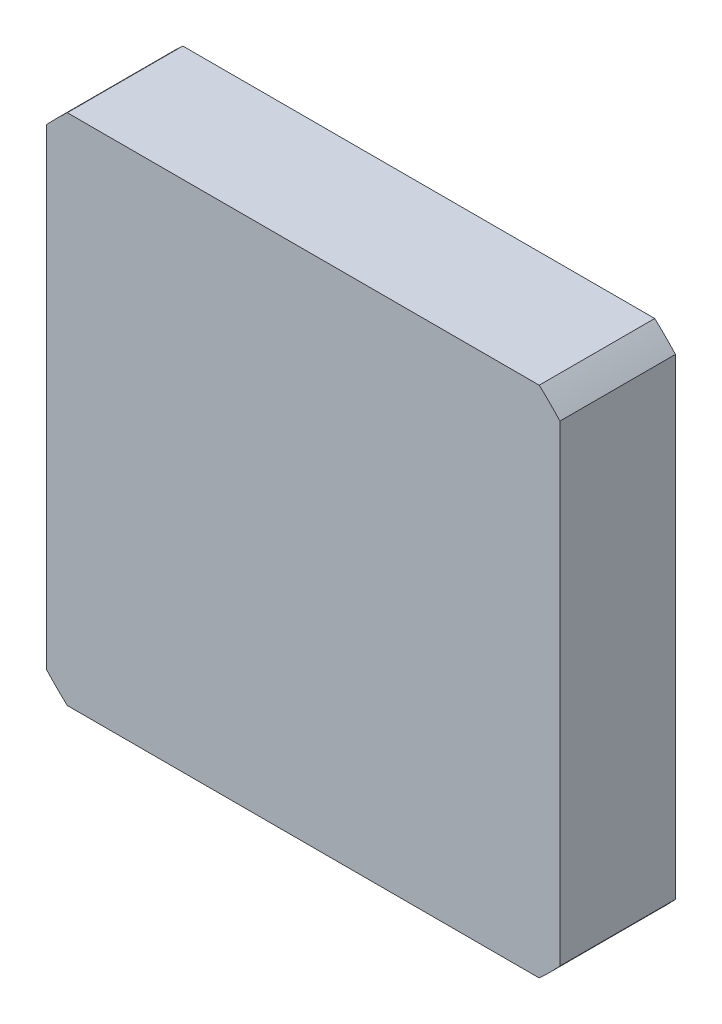
ISO-10303-21;
HEADER;
FILE_DESCRIPTION(('STEP AP214'),'2;1');
FILE_NAME('part.step','',(''),(''),'','','');
FILE_SCHEMA(('AUTOMOTIVE_DESIGN { 1 0 10303 214 1 1 1 1 }'));
ENDSEC;
DATA;
#1=APPLICATION_CONTEXT('core data for automotive mechanical design processes');
#2=APPLICATION_PROTOCOL_DEFINITION('international standard','automotive_design',2000,#1);
#3=PRODUCT_CONTEXT('',#1,'mechanical');
#4=PRODUCT('Part','Part','',(#3));
#5=PRODUCT_RELATED_PRODUCT_CATEGORY('part','',(#4));
#6=PRODUCT_DEFINITION_FORMATION('','',#4);
#7=PRODUCT_DEFINITION_CONTEXT('part definition',#1,'design');
#8=PRODUCT_DEFINITION('design','',#6,#7);
#9=PRODUCT_DEFINITION_SHAPE('','',#8);
#10=(LENGTH_UNIT() NAMED_UNIT(*) SI_UNIT(.MILLI.,.METRE.));
#11=(NAMED_UNIT(*) PLANE_ANGLE_UNIT() SI_UNIT($,.RADIAN.));
#12=(NAMED_UNIT(*) SI_UNIT($,.STERADIAN.) SOLID_ANGLE_UNIT());
#13=UNCERTAINTY_MEASURE_WITH_UNIT(LENGTH_MEASURE(1.E-05),#10,'distance_accuracy_value','');
#14=(GEOMETRIC_REPRESENTATION_CONTEXT(3) GLOBAL_UNCERTAINTY_ASSIGNED_CONTEXT((#13)) GLOBAL_UNIT_ASSIGNED_CONTEXT((#10,
#11,#12)) REPRESENTATION_CONTEXT('',''));
#15=CARTESIAN_POINT('',(0.,0.,0.));
#16=DIRECTION('',(0.,0.,1.));
#17=DIRECTION('',(1.,0.,0.));
#18=AXIS2_PLACEMENT_3D('',#15,#16,#17);
#19=CARTESIAN_POINT('',(60.,0.,27.));
#20=DIRECTION('',(1.,0.,0.));
#21=DIRECTION('',(0.,1.,0.));
#22=AXIS2_PLACEMENT_3D('',#19,#20,#21);
#23=PLANE('',#22);
#24=DIRECTION('',(0.,-1.,0.));
#25=VECTOR('',#24,1.);
#26=CARTESIAN_POINT('',(60.,0.,0.));
#27=LINE('',#26,#25);
#28=CARTESIAN_POINT('',(60.,55.156595253877,0.));
#29=VERTEX_POINT('',#28);
#30=CARTESIAN_POINT('',(60.,-55.1565952538769,0.));
#31=VERTEX_POINT('',#30);
#32=EDGE_CURVE('E136',#29,#31,#27,.T.);
#33=ORIENTED_EDGE('',*,*,#32,.F.);
#34=DIRECTION('',(0.,0.,-1.));
#35=VECTOR('',#34,1.);
#36=CARTESIAN_POINT('',(60.,55.156595253877,27.));
#37=LINE('',#36,#35);
#38=CARTESIAN_POINT('',(60.,55.156595253877,27.));
#39=VERTEX_POINT('',#38);
#40=EDGE_CURVE('E11',#39,#29,#37,.T.);
#41=ORIENTED_EDGE('',*,*,#40,.F.);
#42=DIRECTION('',(0.,-1.,0.));
#43=VECTOR('',#42,1.);
#44=CARTESIAN_POINT('',(60.,0.,27.));
#45=LINE('',#44,#43);
#46=CARTESIAN_POINT('',(60.,-55.1565952538769,27.));
#47=VERTEX_POINT('',#46);
#48=EDGE_CURVE('E173',#39,#47,#45,.T.);
#49=ORIENTED_EDGE('',*,*,#48,.T.);
#50=DIRECTION('',(0.,0.,-1.));
#51=VECTOR('',#50,1.);
#52=CARTESIAN_POINT('',(60.,-55.1565952538769,27.));
#53=LINE('',#52,#51);
#54=EDGE_CURVE('E92',#47,#31,#53,.T.);
#55=ORIENTED_EDGE('',*,*,#54,.T.);
#56=EDGE_LOOP('',(#33,#41,#49,#55));
#57=FACE_BOUND('',#56,.T.);
#58=ADVANCED_FACE('F41',(#57),#23,.T.);
#59=CARTESIAN_POINT('',(0.,0.,27.));
#60=DIRECTION('',(0.,0.,-1.));
#61=DIRECTION('',(-1.,0.,0.));
#62=AXIS2_PLACEMENT_3D('',#59,#60,#61);
#63=CYLINDRICAL_SURFACE('',#62,81.5);
#64=CARTESIAN_POINT('',(0.,0.,0.));
#65=DIRECTION('',(0.,0.,1.));
#66=DIRECTION('',(1.,0.,0.));
#67=AXIS2_PLACEMENT_3D('',#64,#65,#66);
#68=CIRCLE('',#67,81.5);
#69=CARTESIAN_POINT('',(55.156595253877,60.,0.));
#70=VERTEX_POINT('',#69);
#71=EDGE_CURVE('E139',#29,#70,#68,.T.);
#72=ORIENTED_EDGE('',*,*,#71,.T.);
#73=DIRECTION('',(0.,0.,-1.));
#74=VECTOR('',#73,1.);
#75=CARTESIAN_POINT('',(55.156595253877,60.,27.));
#76=LINE('',#75,#74);
#77=CARTESIAN_POINT('',(55.156595253877,60.,27.));
#78=VERTEX_POINT('',#77);
#79=EDGE_CURVE('E49',#78,#70,#76,.T.);
#80=ORIENTED_EDGE('',*,*,#79,.F.);
#81=CARTESIAN_POINT('',(0.,0.,27.));
#82=DIRECTION('',(0.,0.,1.));
#83=DIRECTION('',(1.,0.,0.));
#84=AXIS2_PLACEMENT_3D('',#81,#82,#83);
#85=CIRCLE('',#84,81.5);
#86=EDGE_CURVE('E132',#39,#78,#85,.T.);
#87=ORIENTED_EDGE('',*,*,#86,.F.);
#88=ORIENTED_EDGE('',*,*,#40,.T.);
#89=EDGE_LOOP('',(#72,#80,#87,#88));
#90=FACE_BOUND('',#89,.T.);
#91=ADVANCED_FACE('F166',(#90),#63,.T.);
#92=CARTESIAN_POINT('',(0.,60.,27.));
#93=DIRECTION('',(0.,1.,0.));
#94=DIRECTION('',(0.,0.,1.));
#95=AXIS2_PLACEMENT_3D('',#92,#93,#94);
#96=PLANE('',#95);
#97=DIRECTION('',(1.,0.,0.));
#98=VECTOR('',#97,1.);
#99=CARTESIAN_POINT('',(0.,60.,0.));
#100=LINE('',#99,#98);
#101=CARTESIAN_POINT('',(-55.1565952538769,60.,0.));
#102=VERTEX_POINT('',#101);
#103=EDGE_CURVE('E142',#102,#70,#100,.T.);
#104=ORIENTED_EDGE('',*,*,#103,.F.);
#105=DIRECTION('',(0.,0.,-1.));
#106=VECTOR('',#105,1.);
#107=CARTESIAN_POINT('',(-55.1565952538769,60.,27.));
#108=LINE('',#107,#106);
#109=CARTESIAN_POINT('',(-55.1565952538769,60.,27.));
#110=VERTEX_POINT('',#109);
#111=EDGE_CURVE('E156',#110,#102,#108,.T.);
#112=ORIENTED_EDGE('',*,*,#111,.F.);
#113=DIRECTION('',(1.,0.,0.));
#114=VECTOR('',#113,1.);
#115=CARTESIAN_POINT('',(0.,60.,27.));
#116=LINE('',#115,#114);
#117=EDGE_CURVE('E163',#110,#78,#116,.T.);
#118=ORIENTED_EDGE('',*,*,#117,.T.);
#119=ORIENTED_EDGE('',*,*,#79,.T.);
#120=EDGE_LOOP('',(#104,#112,#118,#119));
#121=FACE_BOUND('',#120,.T.);
#122=ADVANCED_FACE('F161',(#121),#96,.T.);
#123=CARTESIAN_POINT('',(-60.,55.1565952538769,0.));
#124=VERTEX_POINT('',#123);
#125=EDGE_CURVE('E144',#102,#124,#68,.T.);
#126=ORIENTED_EDGE('',*,*,#125,.T.);
#127=DIRECTION('',(0.,0.,-1.));
#128=VECTOR('',#127,1.);
#129=CARTESIAN_POINT('',(-60.,55.1565952538769,27.));
#130=LINE('',#129,#128);
#131=CARTESIAN_POINT('',(-60.,55.1565952538769,27.));
#132=VERTEX_POINT('',#131);
#133=EDGE_CURVE('E153',#132,#124,#130,.T.);
#134=ORIENTED_EDGE('',*,*,#133,.F.);
#135=EDGE_CURVE('E122',#110,#132,#85,.T.);
#136=ORIENTED_EDGE('',*,*,#135,.F.);
#137=ORIENTED_EDGE('',*,*,#111,.T.);
#138=EDGE_LOOP('',(#126,#134,#136,#137));
#139=FACE_BOUND('',#138,.T.);
#140=ADVANCED_FACE('F178',(#139),#63,.T.);
#141=CARTESIAN_POINT('',(-60.,0.,27.));
#142=DIRECTION('',(1.,0.,0.));
#143=DIRECTION('',(0.,1.,0.));
#144=AXIS2_PLACEMENT_3D('',#141,#142,#143);
#145=PLANE('',#144);
#146=DIRECTION('',(0.,-1.,0.));
#147=VECTOR('',#146,1.);
#148=CARTESIAN_POINT('',(-60.,0.,0.));
#149=LINE('',#148,#147);
#150=CARTESIAN_POINT('',(-60.,-55.156595253877,0.));
#151=VERTEX_POINT('',#150);
#152=EDGE_CURVE('E147',#124,#151,#149,.T.);
#153=ORIENTED_EDGE('',*,*,#152,.T.);
#154=DIRECTION('',(0.,0.,-1.));
#155=VECTOR('',#154,1.);
#156=CARTESIAN_POINT('',(-60.,-55.156595253877,27.));
#157=LINE('',#156,#155);
#158=CARTESIAN_POINT('',(-60.,-55.156595253877,27.));
#159=VERTEX_POINT('',#158);
#160=EDGE_CURVE('E127',#159,#151,#157,.T.);
#161=ORIENTED_EDGE('',*,*,#160,.F.);
#162=DIRECTION('',(0.,-1.,0.));
#163=VECTOR('',#162,1.);
#164=CARTESIAN_POINT('',(-60.,0.,27.));
#165=LINE('',#164,#163);
#166=EDGE_CURVE('E117',#132,#159,#165,.T.);
#167=ORIENTED_EDGE('',*,*,#166,.F.);
#168=ORIENTED_EDGE('',*,*,#133,.T.);
#169=EDGE_LOOP('',(#153,#161,#167,#168));
#170=FACE_BOUND('',#169,.T.);
#171=ADVANCED_FACE('F180',(#170),#145,.F.);
#172=CARTESIAN_POINT('',(-55.1565952538769,-60.,0.));
#173=VERTEX_POINT('',#172);
#174=EDGE_CURVE('E126',#151,#173,#68,.T.);
#175=ORIENTED_EDGE('',*,*,#174,.T.);
#176=DIRECTION('',(0.,0.,-1.));
#177=VECTOR('',#176,1.);
#178=CARTESIAN_POINT('',(-55.1565952538769,-60.,27.));
#179=LINE('',#178,#177);
#180=CARTESIAN_POINT('',(-55.1565952538769,-60.,27.));
#181=VERTEX_POINT('',#180);
#182=EDGE_CURVE('E123',#181,#173,#179,.T.);
#183=ORIENTED_EDGE('',*,*,#182,.F.);
#184=EDGE_CURVE('E111',#159,#181,#85,.T.);
#185=ORIENTED_EDGE('',*,*,#184,.F.);
#186=ORIENTED_EDGE('',*,*,#160,.T.);
#187=EDGE_LOOP('',(#175,#183,#185,#186));
#188=FACE_BOUND('',#187,.T.);
#189=ADVANCED_FACE('F124',(#188),#63,.T.);
#190=CARTESIAN_POINT('',(0.,-60.,27.));
#191=DIRECTION('',(0.,1.,0.));
#192=DIRECTION('',(0.,0.,1.));
#193=AXIS2_PLACEMENT_3D('',#190,#191,#192);
#194=PLANE('',#193);
#195=DIRECTION('',(1.,0.,0.));
#196=VECTOR('',#195,1.);
#197=CARTESIAN_POINT('',(0.,-60.,0.));
#198=LINE('',#197,#196);
#199=CARTESIAN_POINT('',(55.156595253877,-60.,0.));
#200=VERTEX_POINT('',#199);
#201=EDGE_CURVE('E85',#173,#200,#198,.T.);
#202=ORIENTED_EDGE('',*,*,#201,.T.);
#203=DIRECTION('',(0.,0.,-1.));
#204=VECTOR('',#203,1.);
#205=CARTESIAN_POINT('',(55.156595253877,-60.,27.));
#206=LINE('',#205,#204);
#207=CARTESIAN_POINT('',(55.156595253877,-60.,27.));
#208=VERTEX_POINT('',#207);
#209=EDGE_CURVE('E128',#208,#200,#206,.T.);
#210=ORIENTED_EDGE('',*,*,#209,.F.);
#211=DIRECTION('',(1.,0.,0.));
#212=VECTOR('',#211,1.);
#213=CARTESIAN_POINT('',(0.,-60.,27.));
#214=LINE('',#213,#212);
#215=EDGE_CURVE('E115',#181,#208,#214,.T.);
#216=ORIENTED_EDGE('',*,*,#215,.F.);
#217=ORIENTED_EDGE('',*,*,#182,.T.);
#218=EDGE_LOOP('',(#202,#210,#216,#217));
#219=FACE_BOUND('',#218,.T.);
#220=ADVANCED_FACE('F130',(#219),#194,.F.);
#221=EDGE_CURVE('E143',#200,#31,#68,.T.);
#222=ORIENTED_EDGE('',*,*,#221,.T.);
#223=ORIENTED_EDGE('',*,*,#54,.F.);
#224=EDGE_CURVE('E57',#208,#47,#85,.T.);
#225=ORIENTED_EDGE('',*,*,#224,.F.);
#226=ORIENTED_EDGE('',*,*,#209,.T.);
#227=EDGE_LOOP('',(#222,#223,#225,#226));
#228=FACE_BOUND('',#227,.T.);
#229=ADVANCED_FACE('F186',(#228),#63,.T.);
#230=CARTESIAN_POINT('',(0.,0.,27.));
#231=DIRECTION('',(0.,0.,1.));
#232=DIRECTION('',(1.,0.,0.));
#233=AXIS2_PLACEMENT_3D('',#230,#231,#232);
#234=PLANE('',#233);
#235=ORIENTED_EDGE('',*,*,#48,.F.);
#236=ORIENTED_EDGE('',*,*,#86,.T.);
#237=ORIENTED_EDGE('',*,*,#117,.F.);
#238=ORIENTED_EDGE('',*,*,#135,.T.);
#239=ORIENTED_EDGE('',*,*,#166,.T.);
#240=ORIENTED_EDGE('',*,*,#184,.T.);
#241=ORIENTED_EDGE('',*,*,#215,.T.);
#242=ORIENTED_EDGE('',*,*,#224,.T.);
#243=EDGE_LOOP('',(#235,#236,#237,#238,#239,#240,#241,#242));
#244=FACE_BOUND('',#243,.T.);
#245=ADVANCED_FACE('F113',(#244),#234,.T.);
#246=CARTESIAN_POINT('',(0.,0.,0.));
#247=DIRECTION('',(0.,0.,1.));
#248=DIRECTION('',(1.,0.,0.));
#249=AXIS2_PLACEMENT_3D('',#246,#247,#248);
#250=PLANE('',#249);
#251=ORIENTED_EDGE('',*,*,#32,.T.);
#252=ORIENTED_EDGE('',*,*,#221,.F.);
#253=ORIENTED_EDGE('',*,*,#201,.F.);
#254=ORIENTED_EDGE('',*,*,#174,.F.);
#255=ORIENTED_EDGE('',*,*,#152,.F.);
#256=ORIENTED_EDGE('',*,*,#125,.F.);
#257=ORIENTED_EDGE('',*,*,#103,.T.);
#258=ORIENTED_EDGE('',*,*,#71,.F.);
#259=EDGE_LOOP('',(#251,#252,#253,#254,#255,#256,#257,#258));
#260=FACE_BOUND('',#259,.T.);
#261=ADVANCED_FACE('F169',(#260),#250,.F.);
#262=CLOSED_SHELL('',(#58,#91,#122,#140,#171,#189,#220,#229,#245,#261));
#263=MANIFOLD_SOLID_BREP('B2',#262);
#264=ADVANCED_BREP_SHAPE_REPRESENTATION('',(#18,#263),#14);
#265=SHAPE_DEFINITION_REPRESENTATION(#9,#264);
ENDSEC;
END-ISO-10303-21;
